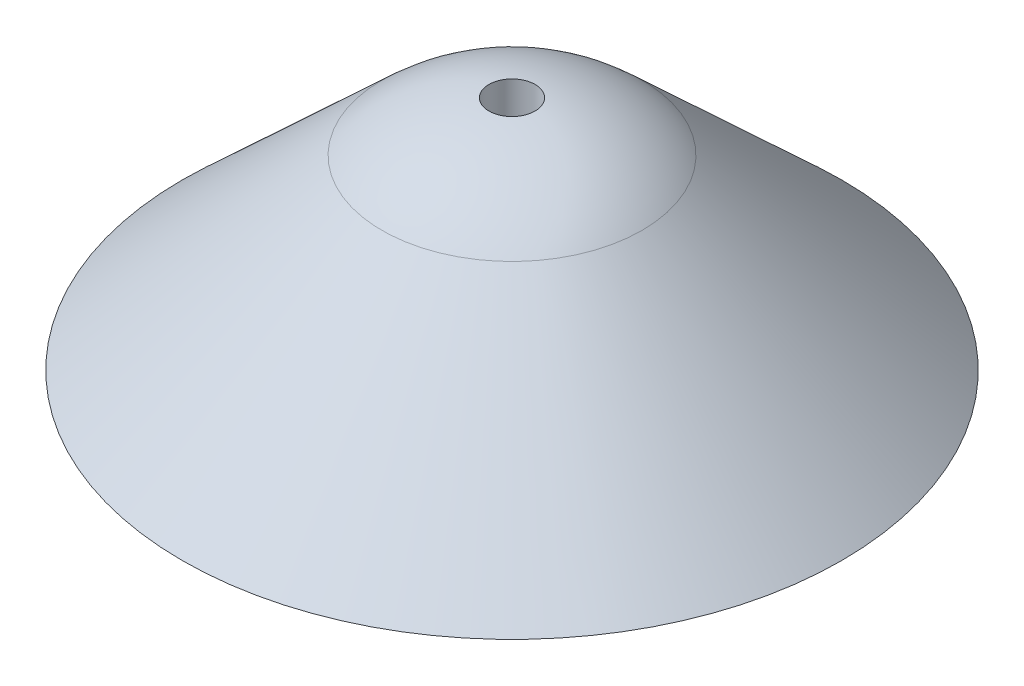
ISO-10303-21;
HEADER;
FILE_DESCRIPTION(('STEP AP214'),'2;1');
FILE_NAME('part.step','',(''),(''),'','','');
FILE_SCHEMA(('AUTOMOTIVE_DESIGN { 1 0 10303 214 1 1 1 1 }'));
ENDSEC;
DATA;
#1=APPLICATION_CONTEXT('core data for automotive mechanical design processes');
#2=APPLICATION_PROTOCOL_DEFINITION('international standard','automotive_design',2000,#1);
#3=PRODUCT_CONTEXT('',#1,'mechanical');
#4=PRODUCT('Part','Part','',(#3));
#5=PRODUCT_RELATED_PRODUCT_CATEGORY('part','',(#4));
#6=PRODUCT_DEFINITION_FORMATION('','',#4);
#7=PRODUCT_DEFINITION_CONTEXT('part definition',#1,'design');
#8=PRODUCT_DEFINITION('design','',#6,#7);
#9=PRODUCT_DEFINITION_SHAPE('','',#8);
#10=(LENGTH_UNIT() NAMED_UNIT(*) SI_UNIT(.MILLI.,.METRE.));
#11=(NAMED_UNIT(*) PLANE_ANGLE_UNIT() SI_UNIT($,.RADIAN.));
#12=(NAMED_UNIT(*) SI_UNIT($,.STERADIAN.) SOLID_ANGLE_UNIT());
#13=UNCERTAINTY_MEASURE_WITH_UNIT(LENGTH_MEASURE(1.E-05),#10,'distance_accuracy_value','');
#14=(GEOMETRIC_REPRESENTATION_CONTEXT(3) GLOBAL_UNCERTAINTY_ASSIGNED_CONTEXT((#13)) GLOBAL_UNIT_ASSIGNED_CONTEXT((#10,
#11,#12)) REPRESENTATION_CONTEXT('',''));
#15=CARTESIAN_POINT('',(0.,0.,0.));
#16=DIRECTION('',(0.,0.,1.));
#17=DIRECTION('',(1.,0.,0.));
#18=AXIS2_PLACEMENT_3D('',#15,#16,#17);
#19=CARTESIAN_POINT('',(0.,3.53640085183953,0.));
#20=DIRECTION('',(0.,-1.,0.));
#21=DIRECTION('',(1.,0.,0.));
#22=AXIS2_PLACEMENT_3D('',#19,#20,#21);
#23=SPHERICAL_SURFACE('',#22,14.4635991481605);
#24=CARTESIAN_POINT('',(0.,17.8937404493648,0.));
#25=DIRECTION('',(0.,-1.,0.));
#26=DIRECTION('',(1.,0.,0.));
#27=AXIS2_PLACEMENT_3D('',#24,#25,#26);
#28=CIRCLE('',#27,1.75);
#29=CARTESIAN_POINT('',(1.75,17.8937404493648,0.));
#30=VERTEX_POINT('',#29);
#31=EDGE_CURVE('E45',#30,#30,#28,.F.);
#32=CARTESIAN_POINT('',(0.,14.1144076275826,0.));
#33=DIRECTION('',(0.,-1.,0.));
#34=DIRECTION('',(1.,0.,0.));
#35=AXIS2_PLACEMENT_3D('',#32,#33,#34);
#36=CIRCLE('',#35,9.86415089964681);
#37=CARTESIAN_POINT('',(9.86415089964681,14.1144076275826,0.));
#38=VERTEX_POINT('',#37);
#39=EDGE_CURVE('E10',#38,#38,#36,.T.);
#40=CARTESIAN_POINT('',(1.75,17.8937404493648,0.));
#41=CARTESIAN_POINT('',(1.84410056534457,17.8822707674593,0.));
#42=CARTESIAN_POINT('',(1.93808833281998,17.8698757063652,0.));
#43=CARTESIAN_POINT('',(2.12580201594856,17.8432401804345,0.));
#44=CARTESIAN_POINT('',(2.21952793160173,17.8289997155979,0.));
#45=CARTESIAN_POINT('',(2.40668165500189,17.798678736817,0.));
#46=CARTESIAN_POINT('',(2.50010946274889,17.7825982228727,0.));
#47=CARTESIAN_POINT('',(2.68663085662732,17.7486034030443,0.));
#48=CARTESIAN_POINT('',(2.77972444275876,17.7306890971602,0.));
#49=CARTESIAN_POINT('',(2.96554140163945,17.6930336083464,0.));
#50=CARTESIAN_POINT('',(3.05826477438872,17.6732924254167,0.));
#51=CARTESIAN_POINT('',(3.24330545981147,17.6319908174065,0.));
#52=CARTESIAN_POINT('',(3.33562277248496,17.6104303923261,0.));
#53=CARTESIAN_POINT('',(3.51981564752463,17.5654986345555,0.));
#54=CARTESIAN_POINT('',(3.61169120989081,17.5421273018654,0.));
#55=CARTESIAN_POINT('',(3.79496506500603,17.4935827645038,0.));
#56=CARTESIAN_POINT('',(3.88636335775507,17.4684095598323,0.));
#57=CARTESIAN_POINT('',(4.0686473388024,17.4162710104808,0.));
#58=CARTESIAN_POINT('',(4.15953302710069,17.3893056658008,0.));
#59=CARTESIAN_POINT('',(4.34075666259724,17.3335932613219,0.));
#60=CARTESIAN_POINT('',(4.4310946097955,17.304846201523,0.));
#61=CARTESIAN_POINT('',(4.61118783819817,17.245581480493,0.));
#62=CARTESIAN_POINT('',(4.70094311940258,17.2150638192618,0.));
#63=CARTESIAN_POINT('',(4.87983631618473,17.1522696935782,0.));
#64=CARTESIAN_POINT('',(4.96897423176246,17.1199932291257,0.));
#65=CARTESIAN_POINT('',(5.1465982363334,17.0536939751671,0.));
#66=CARTESIAN_POINT('',(5.23508432532662,17.0196711856609,0.));
#67=CARTESIAN_POINT('',(5.41137046776868,16.9498924348968,0.));
#68=CARTESIAN_POINT('',(5.49917052121753,16.9141364736389,0.));
#69=CARTESIAN_POINT('',(5.67405064883414,16.8409052027221,0.));
#70=CARTESIAN_POINT('',(5.76113072300192,16.8034298930631,0.));
#71=CARTESIAN_POINT('',(5.93453722666564,16.7267744133998,0.));
#72=CARTESIAN_POINT('',(6.02086365616158,16.6875942433953,0.));
#73=CARTESIAN_POINT('',(6.19272949645192,16.6075441901998,0.));
#74=CARTESIAN_POINT('',(6.27826890724633,16.5666743070089,0.));
#75=CARTESIAN_POINT('',(6.44852764036743,16.4832606278472,0.));
#76=CARTESIAN_POINT('',(6.53324696269413,16.4407168318764,0.));
#77=CARTESIAN_POINT('',(6.70183276616208,16.353971774701,0.));
#78=CARTESIAN_POINT('',(6.78569924730331,16.3097705134963,0.));
#79=CARTESIAN_POINT('',(6.95254694539329,16.2197276141795,0.));
#80=CARTESIAN_POINT('',(7.03552816234202,16.1738859760674,0.));
#81=CARTESIAN_POINT('',(7.20057325128538,16.0805800454361,0.));
#82=CARTESIAN_POINT('',(7.28263712328,16.0331157529169,0.));
#83=CARTESIAN_POINT('',(7.44581579620182,15.9365828632949,0.));
#84=CARTESIAN_POINT('',(7.52693059712902,15.887514266192,0.));
#85=CARTESIAN_POINT('',(7.68817976871516,15.7877917374533,0.));
#86=CARTESIAN_POINT('',(7.76831413937411,15.7371378058174,0.));
#87=CARTESIAN_POINT('',(7.92757147026335,15.6342641909619,0.));
#88=CARTESIAN_POINT('',(8.00669443049363,15.5820445077422,0.));
#89=CARTESIAN_POINT('',(8.16389835136634,15.4760595779777,0.));
#90=CARTESIAN_POINT('',(8.24197931200876,15.4222943314328,0.));
#91=CARTESIAN_POINT('',(8.39706904743406,15.3132390608488,0.));
#92=CARTESIAN_POINT('',(8.47407782221694,15.2579490368096,0.));
#93=CARTESIAN_POINT('',(8.62699341398343,15.1458655863522,0.));
#94=CARTESIAN_POINT('',(8.70290023096705,15.089072159934,0.));
#95=CARTESIAN_POINT('',(8.85358256187944,14.9740038617944,0.));
#96=CARTESIAN_POINT('',(8.92835807580823,14.9157289900729,0.));
#97=CARTESIAN_POINT('',(9.07674889024088,14.7977203283676,0.));
#98=CARTESIAN_POINT('',(9.15036419074474,14.7379865383836,0.));
#99=CARTESIAN_POINT('',(9.29640612575212,14.617083141538,0.));
#100=CARTESIAN_POINT('',(9.36883276025564,14.5559135346763,0.));
#101=CARTESIAN_POINT('',(9.51246933569553,14.432162122027,0.));
#102=CARTESIAN_POINT('',(9.5836792766319,14.3695803162395,0.));
#103=CARTESIAN_POINT('',(9.7248550366261,14.2430288134221,0.));
#104=CARTESIAN_POINT('',(9.79482085568393,14.1790591163921,0.));
#105=CARTESIAN_POINT('',(9.86415089964681,14.1144076275826,0.));
#106=B_SPLINE_CURVE_WITH_KNOTS('',3,(#40,#41,#42,#43,#44,#45,#46,#47,#48,#49,#50,#51,#52,#53,
#54,#55,#56,#57,#58,#59,#60,#61,#62,#63,#64,#65,#66,#67,#68,#69,#70,#71,#72,#73,#74,#75,#76,#77,
#78,#79,#80,#81,#82,#83,#84,#85,#86,#87,#88,#89,#90,#91,#92,#93,#94,#95,#96,#97,#98,#99,#100,
#101,#102,#103,#104,#105),.UNSPECIFIED.,.F.,.F.,(4,2,2,2,2,2,2,2,2,2,2,2,2,2,2,2,2,2,2,2,2,2,2,
2,2,2,2,2,2,2,2,2,4),(0.,0.284386392270128,0.568772784540259,0.853159176810386,1.13754556908052,
1.42193196135065,1.70631835362077,1.9907047458909,2.27509113816103,2.55947753043116,
2.84386392270129,3.12825031497142,3.41263670724155,3.69702309951168,3.9814094917818,
4.26579588405194,4.55018227632207,4.83456866859219,5.11895506086232,5.40334145313245,
5.68772784540258,5.97211423767271,6.25650062994284,6.54088702221296,6.8252734144831,
7.10965980675322,7.39404619902335,7.67843259129348,7.96281898356361,8.24720537583374,
8.53159176810387,8.815978160374,9.10036455264413),.UNSPECIFIED.);
#107=EDGE_CURVE('BSEAM35',#30,#38,#106,.T.);
#108=ORIENTED_EDGE('',*,*,#31,.F.);
#109=ORIENTED_EDGE('',*,*,#39,.F.);
#110=ORIENTED_EDGE('',*,*,#107,.T.);
#111=ORIENTED_EDGE('',*,*,#107,.F.);
#112=EDGE_LOOP('',(#108,#110,#109,#111));
#113=FACE_BOUND('',#112,.T.);
#114=ADVANCED_FACE('F35',(#113),#23,.T.);
#115=CARTESIAN_POINT('',(0.,0.,0.));
#116=DIRECTION('',(0.,-1.,0.));
#117=DIRECTION('',(1.,0.,0.));
#118=AXIS2_PLACEMENT_3D('',#115,#116,#117);
#119=CONICAL_SURFACE('',#118,25.,0.820304748437333);
#120=ORIENTED_EDGE('',*,*,#39,.T.);
#121=EDGE_LOOP('',(#120));
#122=FACE_BOUND('',#121,.T.);
#123=CARTESIAN_POINT('',(0.,0.,0.));
#124=DIRECTION('',(0.,-1.,0.));
#125=DIRECTION('',(1.,0.,0.));
#126=AXIS2_PLACEMENT_3D('',#123,#124,#125);
#127=CIRCLE('',#126,25.);
#128=CARTESIAN_POINT('',(25.,0.,0.));
#129=VERTEX_POINT('',#128);
#130=EDGE_CURVE('E41',#129,#129,#127,.T.);
#131=ORIENTED_EDGE('',*,*,#130,.F.);
#132=EDGE_LOOP('',(#131));
#133=FACE_BOUND('',#132,.T.);
#134=ADVANCED_FACE('F59',(#122,#133),#119,.T.);
#135=CARTESIAN_POINT('',(0.,0.,0.));
#136=DIRECTION('',(0.,-1.,0.));
#137=DIRECTION('',(1.,0.,0.));
#138=AXIS2_PLACEMENT_3D('',#135,#136,#137);
#139=PLANE('',#138);
#140=CARTESIAN_POINT('',(0.,0.,0.));
#141=DIRECTION('',(0.,-1.,0.));
#142=DIRECTION('',(1.,0.,0.));
#143=AXIS2_PLACEMENT_3D('',#140,#141,#142);
#144=CIRCLE('',#143,1.75);
#145=CARTESIAN_POINT('',(1.75,0.,0.));
#146=VERTEX_POINT('',#145);
#147=EDGE_CURVE('E49',#146,#146,#144,.T.);
#148=ORIENTED_EDGE('',*,*,#147,.F.);
#149=EDGE_LOOP('',(#148));
#150=FACE_BOUND('',#149,.T.);
#151=ORIENTED_EDGE('',*,*,#130,.T.);
#152=EDGE_LOOP('',(#151));
#153=FACE_BOUND('',#152,.T.);
#154=ADVANCED_FACE('F57',(#150,#153),#139,.T.);
#155=CARTESIAN_POINT('',(0.,18.,0.));
#156=DIRECTION('',(0.,-1.,0.));
#157=DIRECTION('',(1.,0.,0.));
#158=AXIS2_PLACEMENT_3D('',#155,#156,#157);
#159=CYLINDRICAL_SURFACE('',#158,1.75);
#160=ORIENTED_EDGE('',*,*,#31,.T.);
#161=EDGE_LOOP('',(#160));
#162=FACE_BOUND('',#161,.T.);
#163=ORIENTED_EDGE('',*,*,#147,.T.);
#164=EDGE_LOOP('',(#163));
#165=FACE_BOUND('',#164,.T.);
#166=ADVANCED_FACE('F55',(#162,#165),#159,.F.);
#167=CLOSED_SHELL('',(#114,#134,#154,#166));
#168=MANIFOLD_SOLID_BREP('B2',#167);
#169=ADVANCED_BREP_SHAPE_REPRESENTATION('',(#18,#168),#14);
#170=SHAPE_DEFINITION_REPRESENTATION(#9,#169);
ENDSEC;
END-ISO-10303-21;
